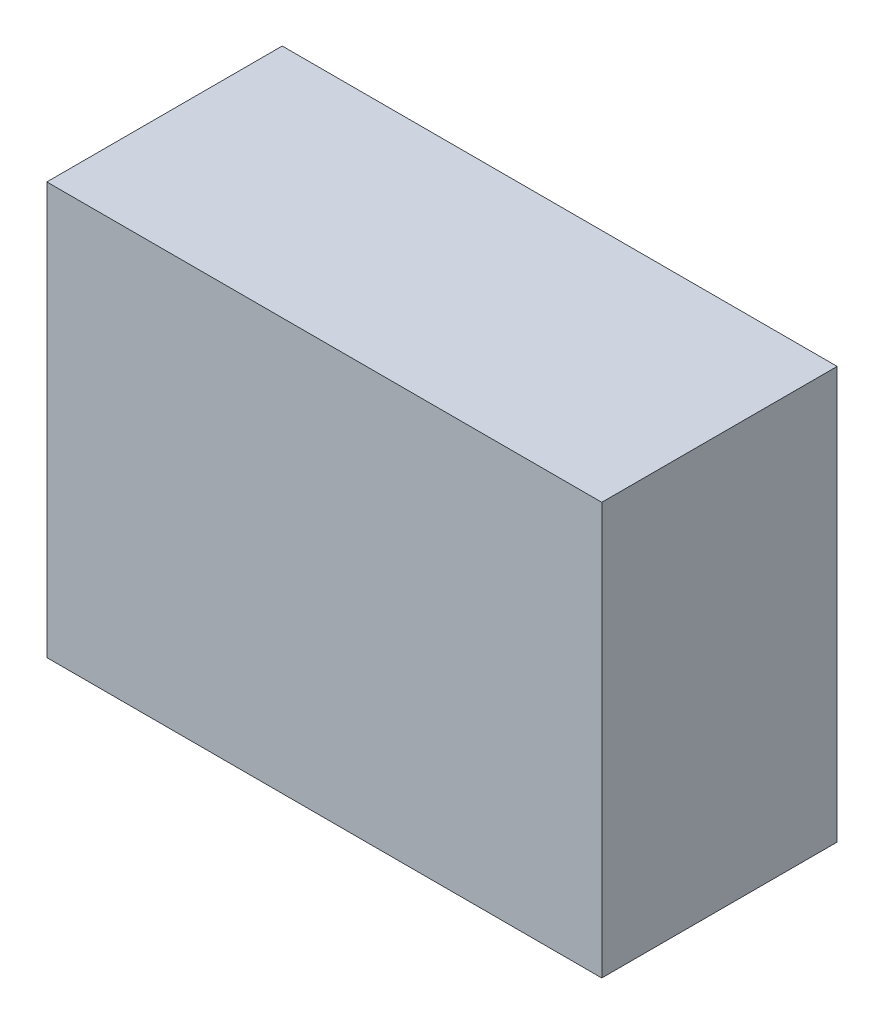
ISO-10303-21;
HEADER;
FILE_DESCRIPTION(('STEP AP214'),'2;1');
FILE_NAME('part.step','',(''),(''),'','','');
FILE_SCHEMA(('AUTOMOTIVE_DESIGN { 1 0 10303 214 1 1 1 1 }'));
ENDSEC;
DATA;
#1=APPLICATION_CONTEXT('core data for automotive mechanical design processes');
#2=APPLICATION_PROTOCOL_DEFINITION('international standard','automotive_design',2000,#1);
#3=PRODUCT_CONTEXT('',#1,'mechanical');
#4=PRODUCT('Part','Part','',(#3));
#5=PRODUCT_RELATED_PRODUCT_CATEGORY('part','',(#4));
#6=PRODUCT_DEFINITION_FORMATION('','',#4);
#7=PRODUCT_DEFINITION_CONTEXT('part definition',#1,'design');
#8=PRODUCT_DEFINITION('design','',#6,#7);
#9=PRODUCT_DEFINITION_SHAPE('','',#8);
#10=(LENGTH_UNIT() NAMED_UNIT(*) SI_UNIT(.MILLI.,.METRE.));
#11=(NAMED_UNIT(*) PLANE_ANGLE_UNIT() SI_UNIT($,.RADIAN.));
#12=(NAMED_UNIT(*) SI_UNIT($,.STERADIAN.) SOLID_ANGLE_UNIT());
#13=UNCERTAINTY_MEASURE_WITH_UNIT(LENGTH_MEASURE(1.E-05),#10,'distance_accuracy_value','');
#14=(GEOMETRIC_REPRESENTATION_CONTEXT(3) GLOBAL_UNCERTAINTY_ASSIGNED_CONTEXT((#13)) GLOBAL_UNIT_ASSIGNED_CONTEXT((#10,
#11,#12)) REPRESENTATION_CONTEXT('',''));
#15=CARTESIAN_POINT('',(0.,0.,0.));
#16=DIRECTION('',(0.,0.,1.));
#17=DIRECTION('',(1.,0.,0.));
#18=AXIS2_PLACEMENT_3D('',#15,#16,#17);
#19=CARTESIAN_POINT('',(-0.0271,0.,1.2));
#20=DIRECTION('',(0.,0.,1.));
#21=DIRECTION('',(1.,0.,0.));
#22=AXIS2_PLACEMENT_3D('',#19,#20,#21);
#23=PLANE('',#22);
#24=DIRECTION('',(1.,0.,0.));
#25=VECTOR('',#24,1.);
#26=CARTESIAN_POINT('',(-1.44154,-1.05004,1.2));
#27=LINE('',#26,#25);
#28=CARTESIAN_POINT('',(-1.44154,-1.05004,1.2));
#29=VERTEX_POINT('',#28);
#30=CARTESIAN_POINT('',(1.38734,-1.05004,1.2));
#31=VERTEX_POINT('',#30);
#32=EDGE_CURVE('E85',#29,#31,#27,.T.);
#33=ORIENTED_EDGE('',*,*,#32,.T.);
#34=DIRECTION('',(0.,1.,0.));
#35=VECTOR('',#34,1.);
#36=CARTESIAN_POINT('',(1.38734,-1.05004,1.2));
#37=LINE('',#36,#35);
#38=CARTESIAN_POINT('',(1.38734,1.05004,1.2));
#39=VERTEX_POINT('',#38);
#40=EDGE_CURVE('E98',#31,#39,#37,.T.);
#41=ORIENTED_EDGE('',*,*,#40,.T.);
#42=DIRECTION('',(-1.,0.,0.));
#43=VECTOR('',#42,1.);
#44=CARTESIAN_POINT('',(1.38734,1.05004,1.2));
#45=LINE('',#44,#43);
#46=CARTESIAN_POINT('',(-1.44154,1.05004,1.2));
#47=VERTEX_POINT('',#46);
#48=EDGE_CURVE('E71',#39,#47,#45,.T.);
#49=ORIENTED_EDGE('',*,*,#48,.T.);
#50=DIRECTION('',(0.,-1.,0.));
#51=VECTOR('',#50,1.);
#52=CARTESIAN_POINT('',(-1.44154,1.05004,1.2));
#53=LINE('',#52,#51);
#54=EDGE_CURVE('E11',#47,#29,#53,.T.);
#55=ORIENTED_EDGE('',*,*,#54,.T.);
#56=EDGE_LOOP('',(#33,#41,#49,#55));
#57=FACE_BOUND('',#56,.T.);
#58=ADVANCED_FACE('F16',(#57),#23,.T.);
#59=CARTESIAN_POINT('',(-0.0271,0.,0.));
#60=DIRECTION('',(0.,0.,1.));
#61=DIRECTION('',(1.,0.,0.));
#62=AXIS2_PLACEMENT_3D('',#59,#60,#61);
#63=PLANE('',#62);
#64=DIRECTION('',(1.,0.,0.));
#65=VECTOR('',#64,1.);
#66=CARTESIAN_POINT('',(-1.44154,-1.05004,0.));
#67=LINE('',#66,#65);
#68=CARTESIAN_POINT('',(-1.44154,-1.05004,0.));
#69=VERTEX_POINT('',#68);
#70=CARTESIAN_POINT('',(1.38734,-1.05004,0.));
#71=VERTEX_POINT('',#70);
#72=EDGE_CURVE('E74',#69,#71,#67,.T.);
#73=ORIENTED_EDGE('',*,*,#72,.F.);
#74=DIRECTION('',(0.,-1.,0.));
#75=VECTOR('',#74,1.);
#76=CARTESIAN_POINT('',(-1.44154,1.05004,0.));
#77=LINE('',#76,#75);
#78=CARTESIAN_POINT('',(-1.44154,1.05004,0.));
#79=VERTEX_POINT('',#78);
#80=EDGE_CURVE('E27',#79,#69,#77,.T.);
#81=ORIENTED_EDGE('',*,*,#80,.F.);
#82=DIRECTION('',(-1.,0.,0.));
#83=VECTOR('',#82,1.);
#84=CARTESIAN_POINT('',(1.38734,1.05004,0.));
#85=LINE('',#84,#83);
#86=CARTESIAN_POINT('',(1.38734,1.05004,0.));
#87=VERTEX_POINT('',#86);
#88=EDGE_CURVE('E94',#87,#79,#85,.T.);
#89=ORIENTED_EDGE('',*,*,#88,.F.);
#90=DIRECTION('',(0.,1.,0.));
#91=VECTOR('',#90,1.);
#92=CARTESIAN_POINT('',(1.38734,-1.05004,0.));
#93=LINE('',#92,#91);
#94=EDGE_CURVE('E20',#71,#87,#93,.T.);
#95=ORIENTED_EDGE('',*,*,#94,.F.);
#96=EDGE_LOOP('',(#73,#81,#89,#95));
#97=FACE_BOUND('',#96,.T.);
#98=ADVANCED_FACE('F18',(#97),#63,.F.);
#99=CARTESIAN_POINT('',(-1.44154,1.05004,0.));
#100=DIRECTION('',(1.,0.,0.));
#101=DIRECTION('',(0.,1.,0.));
#102=AXIS2_PLACEMENT_3D('',#99,#100,#101);
#103=PLANE('',#102);
#104=DIRECTION('',(0.,0.,1.));
#105=VECTOR('',#104,1.);
#106=CARTESIAN_POINT('',(-1.44154,1.05004,0.));
#107=LINE('',#106,#105);
#108=EDGE_CURVE('E67',#79,#47,#107,.T.);
#109=ORIENTED_EDGE('',*,*,#108,.F.);
#110=ORIENTED_EDGE('',*,*,#80,.T.);
#111=DIRECTION('',(0.,0.,1.));
#112=VECTOR('',#111,1.);
#113=CARTESIAN_POINT('',(-1.44154,-1.05004,0.));
#114=LINE('',#113,#112);
#115=EDGE_CURVE('E65',#69,#29,#114,.T.);
#116=ORIENTED_EDGE('',*,*,#115,.T.);
#117=ORIENTED_EDGE('',*,*,#54,.F.);
#118=EDGE_LOOP('',(#109,#110,#116,#117));
#119=FACE_BOUND('',#118,.T.);
#120=ADVANCED_FACE('F63',(#119),#103,.F.);
#121=CARTESIAN_POINT('',(1.38734,1.05004,0.));
#122=DIRECTION('',(0.,-1.,0.));
#123=DIRECTION('',(0.,0.,-1.));
#124=AXIS2_PLACEMENT_3D('',#121,#122,#123);
#125=PLANE('',#124);
#126=DIRECTION('',(0.,0.,1.));
#127=VECTOR('',#126,1.);
#128=CARTESIAN_POINT('',(1.38734,1.05004,0.));
#129=LINE('',#128,#127);
#130=EDGE_CURVE('E102',#87,#39,#129,.T.);
#131=ORIENTED_EDGE('',*,*,#130,.F.);
#132=ORIENTED_EDGE('',*,*,#88,.T.);
#133=ORIENTED_EDGE('',*,*,#108,.T.);
#134=ORIENTED_EDGE('',*,*,#48,.F.);
#135=EDGE_LOOP('',(#131,#132,#133,#134));
#136=FACE_BOUND('',#135,.T.);
#137=ADVANCED_FACE('F116',(#136),#125,.F.);
#138=CARTESIAN_POINT('',(1.38734,-1.05004,0.));
#139=DIRECTION('',(-1.,0.,0.));
#140=DIRECTION('',(0.,0.,1.));
#141=AXIS2_PLACEMENT_3D('',#138,#139,#140);
#142=PLANE('',#141);
#143=DIRECTION('',(0.,0.,1.));
#144=VECTOR('',#143,1.);
#145=CARTESIAN_POINT('',(1.38734,-1.05004,0.));
#146=LINE('',#145,#144);
#147=EDGE_CURVE('E80',#71,#31,#146,.T.);
#148=ORIENTED_EDGE('',*,*,#147,.F.);
#149=ORIENTED_EDGE('',*,*,#94,.T.);
#150=ORIENTED_EDGE('',*,*,#130,.T.);
#151=ORIENTED_EDGE('',*,*,#40,.F.);
#152=EDGE_LOOP('',(#148,#149,#150,#151));
#153=FACE_BOUND('',#152,.T.);
#154=ADVANCED_FACE('F112',(#153),#142,.F.);
#155=CARTESIAN_POINT('',(-1.44154,-1.05004,0.));
#156=DIRECTION('',(0.,1.,0.));
#157=DIRECTION('',(1.,0.,0.));
#158=AXIS2_PLACEMENT_3D('',#155,#156,#157);
#159=PLANE('',#158);
#160=ORIENTED_EDGE('',*,*,#115,.F.);
#161=ORIENTED_EDGE('',*,*,#72,.T.);
#162=ORIENTED_EDGE('',*,*,#147,.T.);
#163=ORIENTED_EDGE('',*,*,#32,.F.);
#164=EDGE_LOOP('',(#160,#161,#162,#163));
#165=FACE_BOUND('',#164,.T.);
#166=ADVANCED_FACE('F83',(#165),#159,.F.);
#167=CLOSED_SHELL('',(#58,#98,#120,#137,#154,#166));
#168=MANIFOLD_SOLID_BREP('B1',#167);
#169=ADVANCED_BREP_SHAPE_REPRESENTATION('',(#18,#168),#14);
#170=SHAPE_DEFINITION_REPRESENTATION(#9,#169);
ENDSEC;
END-ISO-10303-21;
